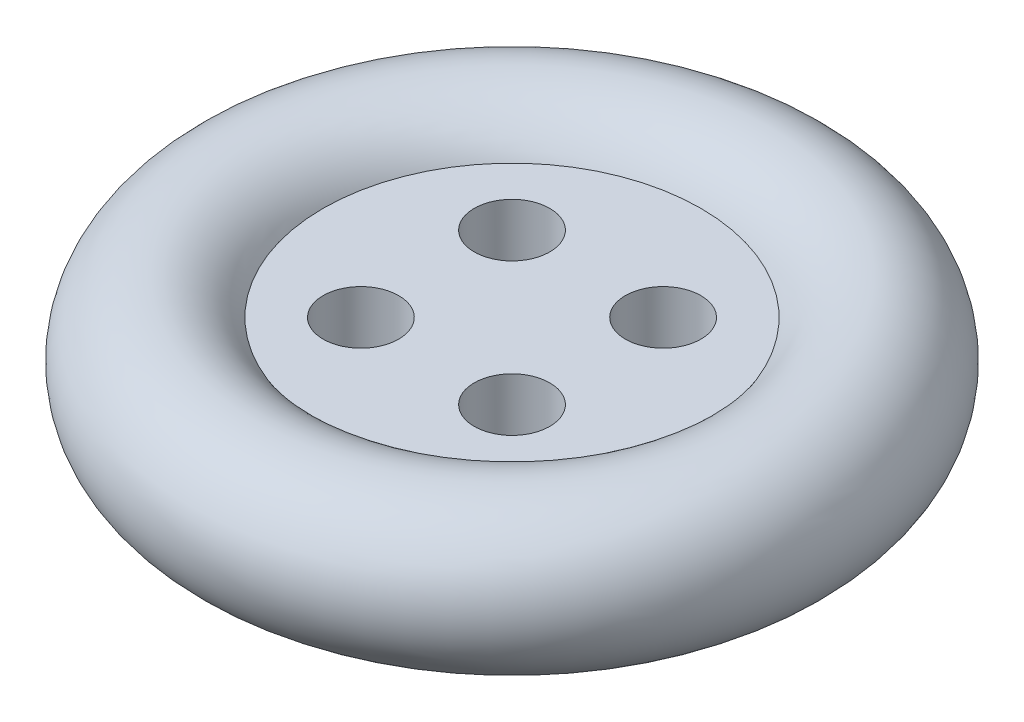
ISO-10303-21;
HEADER;
FILE_DESCRIPTION(('STEP AP214'),'2;1');
FILE_NAME('part.step','',(''),(''),'','','');
FILE_SCHEMA(('AUTOMOTIVE_DESIGN { 1 0 10303 214 1 1 1 1 }'));
ENDSEC;
DATA;
#1=APPLICATION_CONTEXT('core data for automotive mechanical design processes');
#2=APPLICATION_PROTOCOL_DEFINITION('international standard','automotive_design',2000,#1);
#3=PRODUCT_CONTEXT('',#1,'mechanical');
#4=PRODUCT('Part','Part','',(#3));
#5=PRODUCT_RELATED_PRODUCT_CATEGORY('part','',(#4));
#6=PRODUCT_DEFINITION_FORMATION('','',#4);
#7=PRODUCT_DEFINITION_CONTEXT('part definition',#1,'design');
#8=PRODUCT_DEFINITION('design','',#6,#7);
#9=PRODUCT_DEFINITION_SHAPE('','',#8);
#10=(LENGTH_UNIT() NAMED_UNIT(*) SI_UNIT(.MILLI.,.METRE.));
#11=(NAMED_UNIT(*) PLANE_ANGLE_UNIT() SI_UNIT($,.RADIAN.));
#12=(NAMED_UNIT(*) SI_UNIT($,.STERADIAN.) SOLID_ANGLE_UNIT());
#13=UNCERTAINTY_MEASURE_WITH_UNIT(LENGTH_MEASURE(1.E-05),#10,'distance_accuracy_value','');
#14=(GEOMETRIC_REPRESENTATION_CONTEXT(3) GLOBAL_UNCERTAINTY_ASSIGNED_CONTEXT((#13)) GLOBAL_UNIT_ASSIGNED_CONTEXT((#10,
#11,#12)) REPRESENTATION_CONTEXT('',''));
#15=CARTESIAN_POINT('',(0.,0.,0.));
#16=DIRECTION('',(0.,0.,1.));
#17=DIRECTION('',(1.,0.,0.));
#18=AXIS2_PLACEMENT_3D('',#15,#16,#17);
#19=CARTESIAN_POINT('',(0.,0.,10.));
#20=DIRECTION('',(0.,1.,0.));
#21=DIRECTION('',(0.,0.,1.));
#22=AXIS2_PLACEMENT_3D('',#19,#20,#21);
#23=TOROIDAL_SURFACE('',#22,26.9282032302755,8.);
#24=CARTESIAN_POINT('',(0.,3.99999999999999,10.));
#25=DIRECTION('',(0.,1.,0.));
#26=DIRECTION('',(0.,0.,1.));
#27=AXIS2_PLACEMENT_3D('',#24,#25,#26);
#28=CIRCLE('',#27,20.);
#29=CARTESIAN_POINT('',(0.,3.99999999999998,30.));
#30=VERTEX_POINT('',#29);
#31=EDGE_CURVE('E10',#30,#30,#28,.T.);
#32=ORIENTED_EDGE('',*,*,#31,.F.);
#33=EDGE_LOOP('',(#32));
#34=FACE_BOUND('',#33,.T.);
#35=CARTESIAN_POINT('',(0.,-4.00000000000001,10.));
#36=DIRECTION('',(0.,1.,0.));
#37=DIRECTION('',(0.,0.,1.));
#38=AXIS2_PLACEMENT_3D('',#35,#36,#37);
#39=CIRCLE('',#38,20.);
#40=CARTESIAN_POINT('',(0.,-4.00000000000002,30.));
#41=VERTEX_POINT('',#40);
#42=EDGE_CURVE('E48',#41,#41,#39,.T.);
#43=ORIENTED_EDGE('',*,*,#42,.T.);
#44=EDGE_LOOP('',(#43));
#45=FACE_BOUND('',#44,.T.);
#46=ADVANCED_FACE('F41',(#34,#45),#23,.T.);
#47=CARTESIAN_POINT('',(0.,4.,10.));
#48=DIRECTION('',(0.,-1.,0.));
#49=DIRECTION('',(0.,0.,-1.));
#50=AXIS2_PLACEMENT_3D('',#47,#48,#49);
#51=PLANE('',#50);
#52=CARTESIAN_POINT('',(-7.99999999999986,3.99999999999999,17.9999999999999));
#53=DIRECTION('',(0.,-1.,0.));
#54=DIRECTION('',(0.,0.,-1.));
#55=AXIS2_PLACEMENT_3D('',#52,#53,#54);
#56=CIRCLE('',#55,4.);
#57=CARTESIAN_POINT('',(-7.99999999999986,3.99999999999999,13.9999999999999));
#58=VERTEX_POINT('',#57);
#59=EDGE_CURVE('E53',#58,#58,#56,.F.);
#60=ORIENTED_EDGE('',*,*,#59,.F.);
#61=EDGE_LOOP('',(#60));
#62=FACE_BOUND('',#61,.T.);
#63=CARTESIAN_POINT('',(8.00000000000017,3.99999999999999,17.9999999999998));
#64=DIRECTION('',(0.,-1.,0.));
#65=DIRECTION('',(0.,0.,-1.));
#66=AXIS2_PLACEMENT_3D('',#63,#64,#65);
#67=CIRCLE('',#66,4.);
#68=CARTESIAN_POINT('',(8.00000000000017,3.99999999999999,13.9999999999998));
#69=VERTEX_POINT('',#68);
#70=EDGE_CURVE('E66',#69,#69,#67,.F.);
#71=ORIENTED_EDGE('',*,*,#70,.F.);
#72=EDGE_LOOP('',(#71));
#73=FACE_BOUND('',#72,.T.);
#74=CARTESIAN_POINT('',(8.00000000000003,4.,1.99999999999981));
#75=DIRECTION('',(0.,-1.,0.));
#76=DIRECTION('',(0.,0.,-1.));
#77=AXIS2_PLACEMENT_3D('',#74,#75,#76);
#78=CIRCLE('',#77,4.);
#79=CARTESIAN_POINT('',(8.00000000000003,4.,-2.0000000000002));
#80=VERTEX_POINT('',#79);
#81=EDGE_CURVE('E63',#80,#80,#78,.F.);
#82=ORIENTED_EDGE('',*,*,#81,.F.);
#83=EDGE_LOOP('',(#82));
#84=FACE_BOUND('',#83,.T.);
#85=CARTESIAN_POINT('',(-8.,4.,2.));
#86=DIRECTION('',(0.,-1.,0.));
#87=DIRECTION('',(0.,0.,-1.));
#88=AXIS2_PLACEMENT_3D('',#85,#86,#87);
#89=CIRCLE('',#88,4.);
#90=CARTESIAN_POINT('',(-8.,4.,-2.));
#91=VERTEX_POINT('',#90);
#92=EDGE_CURVE('E60',#91,#91,#89,.F.);
#93=ORIENTED_EDGE('',*,*,#92,.F.);
#94=EDGE_LOOP('',(#93));
#95=FACE_BOUND('',#94,.T.);
#96=ORIENTED_EDGE('',*,*,#31,.T.);
#97=EDGE_LOOP('',(#96));
#98=FACE_BOUND('',#97,.T.);
#99=ADVANCED_FACE('F88',(#62,#73,#84,#95,#98),#51,.F.);
#100=CARTESIAN_POINT('',(0.,-4.,10.));
#101=DIRECTION('',(0.,1.,0.));
#102=DIRECTION('',(0.,0.,1.));
#103=AXIS2_PLACEMENT_3D('',#100,#101,#102);
#104=PLANE('',#103);
#105=CARTESIAN_POINT('',(-7.99999999999986,-4.00000000000001,17.9999999999999));
#106=DIRECTION('',(0.,1.,0.));
#107=DIRECTION('',(0.,0.,1.));
#108=AXIS2_PLACEMENT_3D('',#105,#106,#107);
#109=CIRCLE('',#108,4.);
#110=CARTESIAN_POINT('',(-7.99999999999986,-4.00000000000001,21.9999999999999));
#111=VERTEX_POINT('',#110);
#112=EDGE_CURVE('E44',#111,#111,#109,.F.);
#113=ORIENTED_EDGE('',*,*,#112,.F.);
#114=EDGE_LOOP('',(#113));
#115=FACE_BOUND('',#114,.T.);
#116=CARTESIAN_POINT('',(8.00000000000017,-4.00000000000001,17.9999999999998));
#117=DIRECTION('',(0.,1.,0.));
#118=DIRECTION('',(0.,0.,1.));
#119=AXIS2_PLACEMENT_3D('',#116,#117,#118);
#120=CIRCLE('',#119,4.);
#121=CARTESIAN_POINT('',(8.00000000000017,-4.00000000000001,21.9999999999998));
#122=VERTEX_POINT('',#121);
#123=EDGE_CURVE('E64',#122,#122,#120,.F.);
#124=ORIENTED_EDGE('',*,*,#123,.F.);
#125=EDGE_LOOP('',(#124));
#126=FACE_BOUND('',#125,.T.);
#127=CARTESIAN_POINT('',(8.00000000000003,-4.,1.9999999999998));
#128=DIRECTION('',(0.,1.,0.));
#129=DIRECTION('',(0.,0.,1.));
#130=AXIS2_PLACEMENT_3D('',#127,#128,#129);
#131=CIRCLE('',#130,4.);
#132=CARTESIAN_POINT('',(8.00000000000003,-4.,5.9999999999998));
#133=VERTEX_POINT('',#132);
#134=EDGE_CURVE('E61',#133,#133,#131,.F.);
#135=ORIENTED_EDGE('',*,*,#134,.F.);
#136=EDGE_LOOP('',(#135));
#137=FACE_BOUND('',#136,.T.);
#138=CARTESIAN_POINT('',(-8.,-4.,2.));
#139=DIRECTION('',(0.,1.,0.));
#140=DIRECTION('',(0.,0.,1.));
#141=AXIS2_PLACEMENT_3D('',#138,#139,#140);
#142=CIRCLE('',#141,4.);
#143=CARTESIAN_POINT('',(-8.,-4.,6.));
#144=VERTEX_POINT('',#143);
#145=EDGE_CURVE('E57',#144,#144,#142,.F.);
#146=ORIENTED_EDGE('',*,*,#145,.F.);
#147=EDGE_LOOP('',(#146));
#148=FACE_BOUND('',#147,.T.);
#149=ORIENTED_EDGE('',*,*,#42,.F.);
#150=EDGE_LOOP('',(#149));
#151=FACE_BOUND('',#150,.T.);
#152=ADVANCED_FACE('F84',(#115,#126,#137,#148,#151),#104,.F.);
#153=CARTESIAN_POINT('',(-8.,8.00000000000001,2.00000000000001));
#154=DIRECTION('',(0.,-1.,0.));
#155=DIRECTION('',(0.,0.,-1.));
#156=AXIS2_PLACEMENT_3D('',#153,#154,#155);
#157=CYLINDRICAL_SURFACE('',#156,4.);
#158=ORIENTED_EDGE('',*,*,#145,.T.);
#159=EDGE_LOOP('',(#158));
#160=FACE_BOUND('',#159,.T.);
#161=ORIENTED_EDGE('',*,*,#92,.T.);
#162=EDGE_LOOP('',(#161));
#163=FACE_BOUND('',#162,.T.);
#164=ADVANCED_FACE('F87',(#160,#163),#157,.F.);
#165=CARTESIAN_POINT('',(8.00000000000003,8.00000000000001,1.99999999999981));
#166=DIRECTION('',(0.,-1.,0.));
#167=DIRECTION('',(0.,0.,-1.));
#168=AXIS2_PLACEMENT_3D('',#165,#166,#167);
#169=CYLINDRICAL_SURFACE('',#168,4.);
#170=ORIENTED_EDGE('',*,*,#134,.T.);
#171=EDGE_LOOP('',(#170));
#172=FACE_BOUND('',#171,.T.);
#173=ORIENTED_EDGE('',*,*,#81,.T.);
#174=EDGE_LOOP('',(#173));
#175=FACE_BOUND('',#174,.T.);
#176=ADVANCED_FACE('F107',(#172,#175),#169,.F.);
#177=CARTESIAN_POINT('',(8.00000000000017,8.,17.9999999999998));
#178=DIRECTION('',(0.,-1.,0.));
#179=DIRECTION('',(0.,0.,-1.));
#180=AXIS2_PLACEMENT_3D('',#177,#178,#179);
#181=CYLINDRICAL_SURFACE('',#180,4.);
#182=ORIENTED_EDGE('',*,*,#123,.T.);
#183=EDGE_LOOP('',(#182));
#184=FACE_BOUND('',#183,.T.);
#185=ORIENTED_EDGE('',*,*,#70,.T.);
#186=EDGE_LOOP('',(#185));
#187=FACE_BOUND('',#186,.T.);
#188=ADVANCED_FACE('F111',(#184,#187),#181,.F.);
#189=CARTESIAN_POINT('',(-7.99999999999986,8.,17.9999999999999));
#190=DIRECTION('',(0.,-1.,0.));
#191=DIRECTION('',(0.,0.,-1.));
#192=AXIS2_PLACEMENT_3D('',#189,#190,#191);
#193=CYLINDRICAL_SURFACE('',#192,4.);
#194=ORIENTED_EDGE('',*,*,#112,.T.);
#195=EDGE_LOOP('',(#194));
#196=FACE_BOUND('',#195,.T.);
#197=ORIENTED_EDGE('',*,*,#59,.T.);
#198=EDGE_LOOP('',(#197));
#199=FACE_BOUND('',#198,.T.);
#200=ADVANCED_FACE('F82',(#196,#199),#193,.F.);
#201=CLOSED_SHELL('',(#46,#99,#152,#164,#176,#188,#200));
#202=MANIFOLD_SOLID_BREP('B2',#201);
#203=ADVANCED_BREP_SHAPE_REPRESENTATION('',(#18,#202),#14);
#204=SHAPE_DEFINITION_REPRESENTATION(#9,#203);
ENDSEC;
END-ISO-10303-21;
